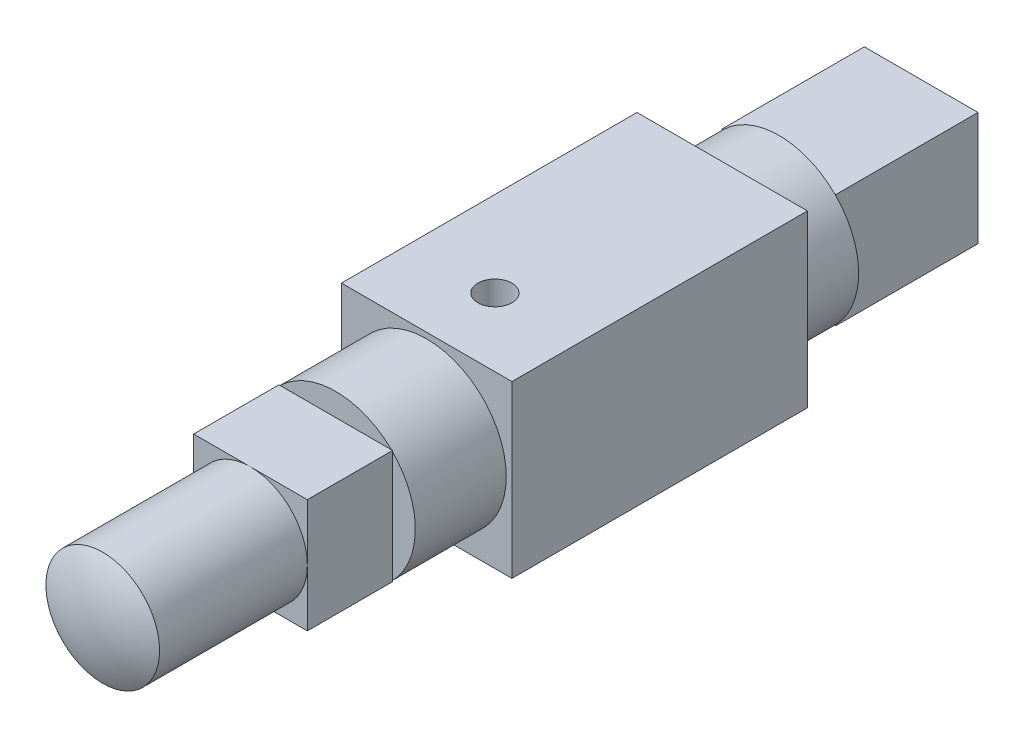
ISO-10303-21;
HEADER;
FILE_DESCRIPTION(('STEP AP214'),'2;1');
FILE_NAME('part.step','',(''),(''),'','','');
FILE_SCHEMA(('AUTOMOTIVE_DESIGN { 1 0 10303 214 1 1 1 1 }'));
ENDSEC;
DATA;
#1=APPLICATION_CONTEXT('core data for automotive mechanical design processes');
#2=APPLICATION_PROTOCOL_DEFINITION('international standard','automotive_design',2000,#1);
#3=PRODUCT_CONTEXT('',#1,'mechanical');
#4=PRODUCT('Part','Part','',(#3));
#5=PRODUCT_RELATED_PRODUCT_CATEGORY('part','',(#4));
#6=PRODUCT_DEFINITION_FORMATION('','',#4);
#7=PRODUCT_DEFINITION_CONTEXT('part definition',#1,'design');
#8=PRODUCT_DEFINITION('design','',#6,#7);
#9=PRODUCT_DEFINITION_SHAPE('','',#8);
#10=(LENGTH_UNIT() NAMED_UNIT(*) SI_UNIT(.MILLI.,.METRE.));
#11=(NAMED_UNIT(*) PLANE_ANGLE_UNIT() SI_UNIT($,.RADIAN.));
#12=(NAMED_UNIT(*) SI_UNIT($,.STERADIAN.) SOLID_ANGLE_UNIT());
#13=UNCERTAINTY_MEASURE_WITH_UNIT(LENGTH_MEASURE(1.E-05),#10,'distance_accuracy_value','');
#14=(GEOMETRIC_REPRESENTATION_CONTEXT(3) GLOBAL_UNCERTAINTY_ASSIGNED_CONTEXT((#13)) GLOBAL_UNIT_ASSIGNED_CONTEXT((#10,
#11,#12)) REPRESENTATION_CONTEXT('',''));
#15=CARTESIAN_POINT('',(0.,0.,0.));
#16=DIRECTION('',(0.,0.,1.));
#17=DIRECTION('',(1.,0.,0.));
#18=AXIS2_PLACEMENT_3D('',#15,#16,#17);
#19=CARTESIAN_POINT('',(0.,0.,-5.));
#20=DIRECTION('',(0.,0.,-1.));
#21=DIRECTION('',(-1.,0.,0.));
#22=AXIS2_PLACEMENT_3D('',#19,#20,#21);
#23=PLANE('',#22);
#24=DIRECTION('',(0.,1.,0.));
#25=VECTOR('',#24,1.);
#26=CARTESIAN_POINT('',(-5.,-5.,-5.));
#27=LINE('',#26,#25);
#28=CARTESIAN_POINT('',(-5.,-4.89897948556636,-5.));
#29=VERTEX_POINT('',#28);
#30=CARTESIAN_POINT('',(-5.,4.89897948556636,-5.));
#31=VERTEX_POINT('',#30);
#32=EDGE_CURVE('E11',#29,#31,#27,.T.);
#33=ORIENTED_EDGE('',*,*,#32,.F.);
#34=CARTESIAN_POINT('',(0.,0.,-5.));
#35=DIRECTION('',(0.,0.,-1.));
#36=DIRECTION('',(-1.,0.,0.));
#37=AXIS2_PLACEMENT_3D('',#34,#35,#36);
#38=CIRCLE('',#37,7.);
#39=EDGE_CURVE('E218',#29,#31,#38,.T.);
#40=ORIENTED_EDGE('',*,*,#39,.T.);
#41=EDGE_LOOP('',(#33,#40));
#42=FACE_BOUND('',#41,.T.);
#43=ADVANCED_FACE('F40',(#42),#23,.T.);
#44=DIRECTION('',(-1.,0.,0.));
#45=VECTOR('',#44,1.);
#46=CARTESIAN_POINT('',(5.,-5.,-5.));
#47=LINE('',#46,#45);
#48=CARTESIAN_POINT('',(4.89897948556636,-5.,-5.));
#49=VERTEX_POINT('',#48);
#50=CARTESIAN_POINT('',(-4.89897948556636,-5.,-5.));
#51=VERTEX_POINT('',#50);
#52=EDGE_CURVE('E49',#49,#51,#47,.T.);
#53=ORIENTED_EDGE('',*,*,#52,.F.);
#54=EDGE_CURVE('E436',#49,#51,#38,.T.);
#55=ORIENTED_EDGE('',*,*,#54,.T.);
#56=EDGE_LOOP('',(#53,#55));
#57=FACE_BOUND('',#56,.T.);
#58=ADVANCED_FACE('F363',(#57),#23,.T.);
#59=DIRECTION('',(0.,-1.,0.));
#60=VECTOR('',#59,1.);
#61=CARTESIAN_POINT('',(5.,-5.,-5.));
#62=LINE('',#61,#60);
#63=CARTESIAN_POINT('',(5.,4.89897948556636,-5.));
#64=VERTEX_POINT('',#63);
#65=CARTESIAN_POINT('',(5.,-4.89897948556636,-5.));
#66=VERTEX_POINT('',#65);
#67=EDGE_CURVE('E398',#64,#66,#62,.T.);
#68=ORIENTED_EDGE('',*,*,#67,.F.);
#69=EDGE_CURVE('E400',#64,#66,#38,.T.);
#70=ORIENTED_EDGE('',*,*,#69,.T.);
#71=EDGE_LOOP('',(#68,#70));
#72=FACE_BOUND('',#71,.T.);
#73=ADVANCED_FACE('F369',(#72),#23,.T.);
#74=CARTESIAN_POINT('',(0.,0.,41.5));
#75=DIRECTION('',(0.,0.,-1.));
#76=DIRECTION('',(-1.,0.,0.));
#77=AXIS2_PLACEMENT_3D('',#74,#75,#76);
#78=PLANE('',#77);
#79=CARTESIAN_POINT('',(0.,0.,41.5));
#80=DIRECTION('',(0.,0.,1.));
#81=DIRECTION('',(1.,0.,0.));
#82=AXIS2_PLACEMENT_3D('',#79,#80,#81);
#83=CIRCLE('',#82,5.);
#84=CARTESIAN_POINT('',(5.,0.,41.5));
#85=VERTEX_POINT('',#84);
#86=CARTESIAN_POINT('',(0.,5.,41.5));
#87=VERTEX_POINT('',#86);
#88=EDGE_CURVE('E227',#85,#87,#83,.T.);
#89=ORIENTED_EDGE('',*,*,#88,.F.);
#90=DIRECTION('',(0.,1.,0.));
#91=VECTOR('',#90,1.);
#92=CARTESIAN_POINT('',(5.,-5.,41.5));
#93=LINE('',#92,#91);
#94=CARTESIAN_POINT('',(5.,5.,41.5));
#95=VERTEX_POINT('',#94);
#96=EDGE_CURVE('E244',#85,#95,#93,.T.);
#97=ORIENTED_EDGE('',*,*,#96,.T.);
#98=DIRECTION('',(-1.,0.,0.));
#99=VECTOR('',#98,1.);
#100=CARTESIAN_POINT('',(-5.,5.,41.5));
#101=LINE('',#100,#99);
#102=EDGE_CURVE('E245',#95,#87,#101,.T.);
#103=ORIENTED_EDGE('',*,*,#102,.T.);
#104=EDGE_LOOP('',(#89,#97,#103));
#105=FACE_BOUND('',#104,.T.);
#106=ADVANCED_FACE('F387',(#105),#78,.F.);
#107=CARTESIAN_POINT('',(-5.,0.,41.5));
#108=VERTEX_POINT('',#107);
#109=EDGE_CURVE('E233',#87,#108,#83,.T.);
#110=ORIENTED_EDGE('',*,*,#109,.F.);
#111=CARTESIAN_POINT('',(-5.,5.,41.5));
#112=VERTEX_POINT('',#111);
#113=EDGE_CURVE('E243',#87,#112,#101,.T.);
#114=ORIENTED_EDGE('',*,*,#113,.T.);
#115=DIRECTION('',(0.,-1.,0.));
#116=VECTOR('',#115,1.);
#117=CARTESIAN_POINT('',(-5.,-5.,41.5));
#118=LINE('',#117,#116);
#119=EDGE_CURVE('E249',#112,#108,#118,.T.);
#120=ORIENTED_EDGE('',*,*,#119,.T.);
#121=EDGE_LOOP('',(#110,#114,#120));
#122=FACE_BOUND('',#121,.T.);
#123=ADVANCED_FACE('F392',(#122),#78,.F.);
#124=CARTESIAN_POINT('',(0.,-5.,41.5));
#125=VERTEX_POINT('',#124);
#126=EDGE_CURVE('E802',#108,#125,#83,.T.);
#127=ORIENTED_EDGE('',*,*,#126,.F.);
#128=CARTESIAN_POINT('',(-5.,-5.,41.5));
#129=VERTEX_POINT('',#128);
#130=EDGE_CURVE('E248',#108,#129,#118,.T.);
#131=ORIENTED_EDGE('',*,*,#130,.T.);
#132=DIRECTION('',(1.,0.,0.));
#133=VECTOR('',#132,1.);
#134=CARTESIAN_POINT('',(-5.,-5.,41.5));
#135=LINE('',#134,#133);
#136=EDGE_CURVE('E253',#129,#125,#135,.T.);
#137=ORIENTED_EDGE('',*,*,#136,.T.);
#138=EDGE_LOOP('',(#127,#131,#137));
#139=FACE_BOUND('',#138,.T.);
#140=ADVANCED_FACE('F582',(#139),#78,.F.);
#141=CARTESIAN_POINT('',(0.,0.,34.));
#142=DIRECTION('',(0.,0.,1.));
#143=DIRECTION('',(1.,0.,0.));
#144=AXIS2_PLACEMENT_3D('',#141,#142,#143);
#145=PLANE('',#144);
#146=DIRECTION('',(0.,1.,0.));
#147=VECTOR('',#146,1.);
#148=CARTESIAN_POINT('',(5.,-5.,34.));
#149=LINE('',#148,#147);
#150=CARTESIAN_POINT('',(5.,-4.89897948556636,34.));
#151=VERTEX_POINT('',#150);
#152=CARTESIAN_POINT('',(5.,4.89897948556636,34.));
#153=VERTEX_POINT('',#152);
#154=EDGE_CURVE('E261',#151,#153,#149,.T.);
#155=ORIENTED_EDGE('',*,*,#154,.F.);
#156=CARTESIAN_POINT('',(0.,0.,34.));
#157=DIRECTION('',(0.,0.,1.));
#158=DIRECTION('',(1.,0.,0.));
#159=AXIS2_PLACEMENT_3D('',#156,#157,#158);
#160=CIRCLE('',#159,7.);
#161=EDGE_CURVE('E287',#151,#153,#160,.T.);
#162=ORIENTED_EDGE('',*,*,#161,.T.);
#163=EDGE_LOOP('',(#155,#162));
#164=FACE_BOUND('',#163,.T.);
#165=ADVANCED_FACE('F591',(#164),#145,.T.);
#166=DIRECTION('',(1.,0.,0.));
#167=VECTOR('',#166,1.);
#168=CARTESIAN_POINT('',(-5.,-5.,34.));
#169=LINE('',#168,#167);
#170=CARTESIAN_POINT('',(-4.89897948556636,-5.,34.));
#171=VERTEX_POINT('',#170);
#172=CARTESIAN_POINT('',(4.89897948556636,-5.,34.));
#173=VERTEX_POINT('',#172);
#174=EDGE_CURVE('E275',#171,#173,#169,.T.);
#175=ORIENTED_EDGE('',*,*,#174,.F.);
#176=EDGE_CURVE('E813',#171,#173,#160,.T.);
#177=ORIENTED_EDGE('',*,*,#176,.T.);
#178=EDGE_LOOP('',(#175,#177));
#179=FACE_BOUND('',#178,.T.);
#180=ADVANCED_FACE('F684',(#179),#145,.T.);
#181=DIRECTION('',(0.,-1.,0.));
#182=VECTOR('',#181,1.);
#183=CARTESIAN_POINT('',(-5.,-5.,34.));
#184=LINE('',#183,#182);
#185=CARTESIAN_POINT('',(-5.,4.89897948556636,34.));
#186=VERTEX_POINT('',#185);
#187=CARTESIAN_POINT('',(-5.,-4.89897948556636,34.));
#188=VERTEX_POINT('',#187);
#189=EDGE_CURVE('E271',#186,#188,#184,.T.);
#190=ORIENTED_EDGE('',*,*,#189,.F.);
#191=EDGE_CURVE('E816',#186,#188,#160,.T.);
#192=ORIENTED_EDGE('',*,*,#191,.T.);
#193=EDGE_LOOP('',(#190,#192));
#194=FACE_BOUND('',#193,.T.);
#195=ADVANCED_FACE('F695',(#194),#145,.T.);
#196=CARTESIAN_POINT('',(7.5,-7.5,26.));
#197=DIRECTION('',(-1.,0.,0.));
#198=DIRECTION('',(0.,0.,1.));
#199=AXIS2_PLACEMENT_3D('',#196,#197,#198);
#200=PLANE('',#199);
#201=DIRECTION('',(0.,1.,0.));
#202=VECTOR('',#201,1.);
#203=CARTESIAN_POINT('',(7.5,-7.5,0.));
#204=LINE('',#203,#202);
#205=CARTESIAN_POINT('',(7.5,-7.5,0.));
#206=VERTEX_POINT('',#205);
#207=CARTESIAN_POINT('',(7.5,7.5,0.));
#208=VERTEX_POINT('',#207);
#209=EDGE_CURVE('E299',#206,#208,#204,.T.);
#210=ORIENTED_EDGE('',*,*,#209,.T.);
#211=DIRECTION('',(0.,0.,-1.));
#212=VECTOR('',#211,1.);
#213=CARTESIAN_POINT('',(7.5,7.5,26.));
#214=LINE('',#213,#212);
#215=CARTESIAN_POINT('',(7.5,7.5,26.));
#216=VERTEX_POINT('',#215);
#217=EDGE_CURVE('E44',#216,#208,#214,.T.);
#218=ORIENTED_EDGE('',*,*,#217,.F.);
#219=DIRECTION('',(0.,1.,0.));
#220=VECTOR('',#219,1.);
#221=CARTESIAN_POINT('',(7.5,-7.5,26.));
#222=LINE('',#221,#220);
#223=CARTESIAN_POINT('',(7.5,-7.5,26.));
#224=VERTEX_POINT('',#223);
#225=EDGE_CURVE('E302',#224,#216,#222,.T.);
#226=ORIENTED_EDGE('',*,*,#225,.F.);
#227=DIRECTION('',(0.,0.,-1.));
#228=VECTOR('',#227,1.);
#229=CARTESIAN_POINT('',(7.5,-7.5,26.));
#230=LINE('',#229,#228);
#231=EDGE_CURVE('E312',#224,#206,#230,.T.);
#232=ORIENTED_EDGE('',*,*,#231,.T.);
#233=EDGE_LOOP('',(#210,#218,#226,#232));
#234=FACE_BOUND('',#233,.T.);
#235=ADVANCED_FACE('F42',(#234),#200,.F.);
#236=CARTESIAN_POINT('',(-7.5,7.5,26.));
#237=DIRECTION('',(0.,-1.,0.));
#238=DIRECTION('',(0.,0.,-1.));
#239=AXIS2_PLACEMENT_3D('',#236,#237,#238);
#240=PLANE('',#239);
#241=CARTESIAN_POINT('',(0.,7.5,20.));
#242=DIRECTION('',(0.,1.,0.));
#243=DIRECTION('',(0.,0.,1.));
#244=AXIS2_PLACEMENT_3D('',#241,#242,#243);
#245=CIRCLE('',#244,1.5);
#246=CARTESIAN_POINT('',(0.,7.5,21.5));
#247=VERTEX_POINT('',#246);
#248=EDGE_CURVE('E291',#247,#247,#245,.T.);
#249=ORIENTED_EDGE('',*,*,#248,.F.);
#250=EDGE_LOOP('',(#249));
#251=FACE_BOUND('',#250,.T.);
#252=DIRECTION('',(-1.,0.,0.));
#253=VECTOR('',#252,1.);
#254=CARTESIAN_POINT('',(-7.5,7.5,0.));
#255=LINE('',#254,#253);
#256=CARTESIAN_POINT('',(-7.5,7.5,0.));
#257=VERTEX_POINT('',#256);
#258=EDGE_CURVE('E315',#208,#257,#255,.T.);
#259=ORIENTED_EDGE('',*,*,#258,.T.);
#260=DIRECTION('',(0.,0.,-1.));
#261=VECTOR('',#260,1.);
#262=CARTESIAN_POINT('',(-7.5,7.5,26.));
#263=LINE('',#262,#261);
#264=CARTESIAN_POINT('',(-7.5,7.5,26.));
#265=VERTEX_POINT('',#264);
#266=EDGE_CURVE('E324',#265,#257,#263,.T.);
#267=ORIENTED_EDGE('',*,*,#266,.F.);
#268=DIRECTION('',(-1.,0.,0.));
#269=VECTOR('',#268,1.);
#270=CARTESIAN_POINT('',(-7.5,7.5,26.));
#271=LINE('',#270,#269);
#272=EDGE_CURVE('E305',#216,#265,#271,.T.);
#273=ORIENTED_EDGE('',*,*,#272,.F.);
#274=ORIENTED_EDGE('',*,*,#217,.T.);
#275=EDGE_LOOP('',(#259,#267,#273,#274));
#276=FACE_BOUND('',#275,.T.);
#277=ADVANCED_FACE('F333',(#251,#276),#240,.F.);
#278=CARTESIAN_POINT('',(-7.5,-7.5,26.));
#279=DIRECTION('',(1.,0.,0.));
#280=DIRECTION('',(0.,0.,-1.));
#281=AXIS2_PLACEMENT_3D('',#278,#279,#280);
#282=PLANE('',#281);
#283=DIRECTION('',(0.,-1.,0.));
#284=VECTOR('',#283,1.);
#285=CARTESIAN_POINT('',(-7.5,-7.5,0.));
#286=LINE('',#285,#284);
#287=CARTESIAN_POINT('',(-7.5,-7.5,0.));
#288=VERTEX_POINT('',#287);
#289=EDGE_CURVE('E317',#257,#288,#286,.T.);
#290=ORIENTED_EDGE('',*,*,#289,.T.);
#291=DIRECTION('',(0.,0.,-1.));
#292=VECTOR('',#291,1.);
#293=CARTESIAN_POINT('',(-7.5,-7.5,26.));
#294=LINE('',#293,#292);
#295=CARTESIAN_POINT('',(-7.5,-7.5,26.));
#296=VERTEX_POINT('',#295);
#297=EDGE_CURVE('E322',#296,#288,#294,.T.);
#298=ORIENTED_EDGE('',*,*,#297,.F.);
#299=DIRECTION('',(0.,-1.,0.));
#300=VECTOR('',#299,1.);
#301=CARTESIAN_POINT('',(-7.5,-7.5,26.));
#302=LINE('',#301,#300);
#303=EDGE_CURVE('E308',#265,#296,#302,.T.);
#304=ORIENTED_EDGE('',*,*,#303,.F.);
#305=ORIENTED_EDGE('',*,*,#266,.T.);
#306=EDGE_LOOP('',(#290,#298,#304,#305));
#307=FACE_BOUND('',#306,.T.);
#308=ADVANCED_FACE('F342',(#307),#282,.F.);
#309=CARTESIAN_POINT('',(-7.5,-7.5,26.));
#310=DIRECTION('',(0.,1.,0.));
#311=DIRECTION('',(0.,0.,1.));
#312=AXIS2_PLACEMENT_3D('',#309,#310,#311);
#313=PLANE('',#312);
#314=CARTESIAN_POINT('',(0.,-7.5,20.));
#315=DIRECTION('',(0.,1.,0.));
#316=DIRECTION('',(0.,0.,1.));
#317=AXIS2_PLACEMENT_3D('',#314,#315,#316);
#318=CIRCLE('',#317,1.5);
#319=CARTESIAN_POINT('',(0.,-7.5,21.5));
#320=VERTEX_POINT('',#319);
#321=EDGE_CURVE('E296',#320,#320,#318,.T.);
#322=ORIENTED_EDGE('',*,*,#321,.T.);
#323=EDGE_LOOP('',(#322));
#324=FACE_BOUND('',#323,.T.);
#325=DIRECTION('',(1.,0.,0.));
#326=VECTOR('',#325,1.);
#327=CARTESIAN_POINT('',(-7.5,-7.5,0.));
#328=LINE('',#327,#326);
#329=EDGE_CURVE('E306',#288,#206,#328,.T.);
#330=ORIENTED_EDGE('',*,*,#329,.T.);
#331=ORIENTED_EDGE('',*,*,#231,.F.);
#332=DIRECTION('',(1.,0.,0.));
#333=VECTOR('',#332,1.);
#334=CARTESIAN_POINT('',(-7.5,-7.5,26.));
#335=LINE('',#334,#333);
#336=EDGE_CURVE('E310',#296,#224,#335,.T.);
#337=ORIENTED_EDGE('',*,*,#336,.F.);
#338=ORIENTED_EDGE('',*,*,#297,.T.);
#339=EDGE_LOOP('',(#330,#331,#337,#338));
#340=FACE_BOUND('',#339,.T.);
#341=ADVANCED_FACE('F345',(#324,#340),#313,.F.);
#342=CARTESIAN_POINT('',(0.,0.,26.));
#343=DIRECTION('',(0.,0.,-1.));
#344=DIRECTION('',(-1.,0.,0.));
#345=AXIS2_PLACEMENT_3D('',#342,#343,#344);
#346=PLANE('',#345);
#347=CARTESIAN_POINT('',(0.,0.,26.));
#348=DIRECTION('',(0.,0.,1.));
#349=DIRECTION('',(1.,0.,0.));
#350=AXIS2_PLACEMENT_3D('',#347,#348,#349);
#351=CIRCLE('',#350,7.);
#352=CARTESIAN_POINT('',(7.,0.,26.));
#353=VERTEX_POINT('',#352);
#354=EDGE_CURVE('E293',#353,#353,#351,.T.);
#355=ORIENTED_EDGE('',*,*,#354,.F.);
#356=EDGE_LOOP('',(#355));
#357=FACE_BOUND('',#356,.T.);
#358=ORIENTED_EDGE('',*,*,#225,.T.);
#359=ORIENTED_EDGE('',*,*,#272,.T.);
#360=ORIENTED_EDGE('',*,*,#303,.T.);
#361=ORIENTED_EDGE('',*,*,#336,.T.);
#362=EDGE_LOOP('',(#358,#359,#360,#361));
#363=FACE_BOUND('',#362,.T.);
#364=ADVANCED_FACE('F347',(#357,#363),#346,.F.);
#365=CARTESIAN_POINT('',(0.,0.,0.));
#366=DIRECTION('',(0.,0.,-1.));
#367=DIRECTION('',(-1.,0.,0.));
#368=AXIS2_PLACEMENT_3D('',#365,#366,#367);
#369=PLANE('',#368);
#370=CARTESIAN_POINT('',(0.,0.,0.));
#371=DIRECTION('',(0.,0.,-1.));
#372=DIRECTION('',(-1.,0.,0.));
#373=AXIS2_PLACEMENT_3D('',#370,#371,#372);
#374=CIRCLE('',#373,7.);
#375=CARTESIAN_POINT('',(-7.,0.,0.));
#376=VERTEX_POINT('',#375);
#377=EDGE_CURVE('E229',#376,#376,#374,.T.);
#378=ORIENTED_EDGE('',*,*,#377,.F.);
#379=EDGE_LOOP('',(#378));
#380=FACE_BOUND('',#379,.T.);
#381=ORIENTED_EDGE('',*,*,#209,.F.);
#382=ORIENTED_EDGE('',*,*,#329,.F.);
#383=ORIENTED_EDGE('',*,*,#289,.F.);
#384=ORIENTED_EDGE('',*,*,#258,.F.);
#385=EDGE_LOOP('',(#381,#382,#383,#384));
#386=FACE_BOUND('',#385,.T.);
#387=ADVANCED_FACE('F340',(#380,#386),#369,.T.);
#388=CARTESIAN_POINT('',(0.,-7.5,20.));
#389=DIRECTION('',(0.,1.,0.));
#390=DIRECTION('',(0.,0.,1.));
#391=AXIS2_PLACEMENT_3D('',#388,#389,#390);
#392=CYLINDRICAL_SURFACE('',#391,1.5);
#393=ORIENTED_EDGE('',*,*,#321,.F.);
#394=EDGE_LOOP('',(#393));
#395=FACE_BOUND('',#394,.T.);
#396=ORIENTED_EDGE('',*,*,#248,.T.);
#397=EDGE_LOOP('',(#396));
#398=FACE_BOUND('',#397,.T.);
#399=ADVANCED_FACE('F355',(#395,#398),#392,.F.);
#400=CARTESIAN_POINT('',(0.,0.,34.));
#401=DIRECTION('',(0.,0.,-1.));
#402=DIRECTION('',(-1.,0.,0.));
#403=AXIS2_PLACEMENT_3D('',#400,#401,#402);
#404=CYLINDRICAL_SURFACE('',#403,7.);
#405=CARTESIAN_POINT('',(4.89897948556636,5.,34.));
#406=VERTEX_POINT('',#405);
#407=EDGE_CURVE('E288',#153,#406,#160,.T.);
#408=ORIENTED_EDGE('',*,*,#407,.F.);
#409=ORIENTED_EDGE('',*,*,#161,.F.);
#410=EDGE_CURVE('E810',#173,#151,#160,.T.);
#411=ORIENTED_EDGE('',*,*,#410,.F.);
#412=ORIENTED_EDGE('',*,*,#176,.F.);
#413=EDGE_CURVE('E814',#188,#171,#160,.T.);
#414=ORIENTED_EDGE('',*,*,#413,.F.);
#415=ORIENTED_EDGE('',*,*,#191,.F.);
#416=CARTESIAN_POINT('',(-4.89897948556636,5.,34.));
#417=VERTEX_POINT('',#416);
#418=EDGE_CURVE('E820',#417,#186,#160,.T.);
#419=ORIENTED_EDGE('',*,*,#418,.F.);
#420=EDGE_CURVE('E292',#406,#417,#160,.T.);
#421=ORIENTED_EDGE('',*,*,#420,.F.);
#422=EDGE_LOOP('',(#408,#409,#411,#412,#414,#415,#419,#421));
#423=FACE_BOUND('',#422,.T.);
#424=ORIENTED_EDGE('',*,*,#354,.T.);
#425=EDGE_LOOP('',(#424));
#426=FACE_BOUND('',#425,.T.);
#427=ADVANCED_FACE('F712',(#423,#426),#404,.T.);
#428=DIRECTION('',(-1.,0.,0.));
#429=VECTOR('',#428,1.);
#430=CARTESIAN_POINT('',(-5.,5.,34.));
#431=LINE('',#430,#429);
#432=EDGE_CURVE('E266',#406,#417,#431,.T.);
#433=ORIENTED_EDGE('',*,*,#432,.F.);
#434=ORIENTED_EDGE('',*,*,#420,.T.);
#435=EDGE_LOOP('',(#433,#434));
#436=FACE_BOUND('',#435,.T.);
#437=ADVANCED_FACE('F674',(#436),#145,.T.);
#438=CARTESIAN_POINT('',(0.,0.,34.));
#439=DIRECTION('',(0.,0.,-1.));
#440=DIRECTION('',(-1.,0.,0.));
#441=AXIS2_PLACEMENT_3D('',#438,#439,#440);
#442=PLANE('',#441);
#443=CARTESIAN_POINT('',(5.,5.,34.));
#444=VERTEX_POINT('',#443);
#445=EDGE_CURVE('E237',#153,#444,#149,.T.);
#446=ORIENTED_EDGE('',*,*,#445,.F.);
#447=ORIENTED_EDGE('',*,*,#407,.T.);
#448=EDGE_CURVE('E262',#444,#406,#431,.T.);
#449=ORIENTED_EDGE('',*,*,#448,.F.);
#450=EDGE_LOOP('',(#446,#447,#449));
#451=FACE_BOUND('',#450,.T.);
#452=ADVANCED_FACE('F602',(#451),#442,.T.);
#453=CARTESIAN_POINT('',(-5.,5.,34.));
#454=VERTEX_POINT('',#453);
#455=EDGE_CURVE('E260',#417,#454,#431,.T.);
#456=ORIENTED_EDGE('',*,*,#455,.F.);
#457=ORIENTED_EDGE('',*,*,#418,.T.);
#458=EDGE_CURVE('E267',#454,#186,#184,.T.);
#459=ORIENTED_EDGE('',*,*,#458,.F.);
#460=EDGE_LOOP('',(#456,#457,#459));
#461=FACE_BOUND('',#460,.T.);
#462=ADVANCED_FACE('F657',(#461),#442,.T.);
#463=CARTESIAN_POINT('',(-5.,-5.,34.));
#464=VERTEX_POINT('',#463);
#465=EDGE_CURVE('E265',#188,#464,#184,.T.);
#466=ORIENTED_EDGE('',*,*,#465,.F.);
#467=ORIENTED_EDGE('',*,*,#413,.T.);
#468=EDGE_CURVE('E272',#464,#171,#169,.T.);
#469=ORIENTED_EDGE('',*,*,#468,.F.);
#470=EDGE_LOOP('',(#466,#467,#469));
#471=FACE_BOUND('',#470,.T.);
#472=ADVANCED_FACE('F603',(#471),#442,.T.);
#473=CARTESIAN_POINT('',(5.,-5.,41.5));
#474=DIRECTION('',(-1.,0.,0.));
#475=DIRECTION('',(0.,0.,1.));
#476=AXIS2_PLACEMENT_3D('',#473,#474,#475);
#477=PLANE('',#476);
#478=CARTESIAN_POINT('',(5.,-5.,34.));
#479=VERTEX_POINT('',#478);
#480=EDGE_CURVE('E257',#479,#151,#149,.T.);
#481=ORIENTED_EDGE('',*,*,#480,.T.);
#482=ORIENTED_EDGE('',*,*,#154,.T.);
#483=ORIENTED_EDGE('',*,*,#445,.T.);
#484=DIRECTION('',(0.,0.,-1.));
#485=VECTOR('',#484,1.);
#486=CARTESIAN_POINT('',(5.,5.,41.5));
#487=LINE('',#486,#485);
#488=EDGE_CURVE('E284',#95,#444,#487,.T.);
#489=ORIENTED_EDGE('',*,*,#488,.F.);
#490=ORIENTED_EDGE('',*,*,#96,.F.);
#491=CARTESIAN_POINT('',(5.,-5.,41.5));
#492=VERTEX_POINT('',#491);
#493=EDGE_CURVE('E241',#492,#85,#93,.T.);
#494=ORIENTED_EDGE('',*,*,#493,.F.);
#495=DIRECTION('',(0.,0.,-1.));
#496=VECTOR('',#495,1.);
#497=CARTESIAN_POINT('',(5.,-5.,41.5));
#498=LINE('',#497,#496);
#499=EDGE_CURVE('E256',#492,#479,#498,.T.);
#500=ORIENTED_EDGE('',*,*,#499,.T.);
#501=EDGE_LOOP('',(#481,#482,#483,#489,#490,#494,#500));
#502=FACE_BOUND('',#501,.T.);
#503=ADVANCED_FACE('F640',(#502),#477,.F.);
#504=CARTESIAN_POINT('',(-5.,5.,41.5));
#505=DIRECTION('',(0.,-1.,0.));
#506=DIRECTION('',(0.,0.,-1.));
#507=AXIS2_PLACEMENT_3D('',#504,#505,#506);
#508=PLANE('',#507);
#509=ORIENTED_EDGE('',*,*,#448,.T.);
#510=ORIENTED_EDGE('',*,*,#432,.T.);
#511=ORIENTED_EDGE('',*,*,#455,.T.);
#512=DIRECTION('',(0.,0.,-1.));
#513=VECTOR('',#512,1.);
#514=CARTESIAN_POINT('',(-5.,5.,41.5));
#515=LINE('',#514,#513);
#516=EDGE_CURVE('E281',#112,#454,#515,.T.);
#517=ORIENTED_EDGE('',*,*,#516,.F.);
#518=ORIENTED_EDGE('',*,*,#113,.F.);
#519=ORIENTED_EDGE('',*,*,#102,.F.);
#520=ORIENTED_EDGE('',*,*,#488,.T.);
#521=EDGE_LOOP('',(#509,#510,#511,#517,#518,#519,#520));
#522=FACE_BOUND('',#521,.T.);
#523=ADVANCED_FACE('F630',(#522),#508,.F.);
#524=CARTESIAN_POINT('',(-5.,-5.,41.5));
#525=DIRECTION('',(1.,0.,0.));
#526=DIRECTION('',(0.,0.,-1.));
#527=AXIS2_PLACEMENT_3D('',#524,#525,#526);
#528=PLANE('',#527);
#529=ORIENTED_EDGE('',*,*,#458,.T.);
#530=ORIENTED_EDGE('',*,*,#189,.T.);
#531=ORIENTED_EDGE('',*,*,#465,.T.);
#532=DIRECTION('',(0.,0.,-1.));
#533=VECTOR('',#532,1.);
#534=CARTESIAN_POINT('',(-5.,-5.,41.5));
#535=LINE('',#534,#533);
#536=EDGE_CURVE('E278',#129,#464,#535,.T.);
#537=ORIENTED_EDGE('',*,*,#536,.F.);
#538=ORIENTED_EDGE('',*,*,#130,.F.);
#539=ORIENTED_EDGE('',*,*,#119,.F.);
#540=ORIENTED_EDGE('',*,*,#516,.T.);
#541=EDGE_LOOP('',(#529,#530,#531,#537,#538,#539,#540));
#542=FACE_BOUND('',#541,.T.);
#543=ADVANCED_FACE('F620',(#542),#528,.F.);
#544=CARTESIAN_POINT('',(-5.,-5.,41.5));
#545=DIRECTION('',(0.,1.,0.));
#546=DIRECTION('',(-1.,0.,0.));
#547=AXIS2_PLACEMENT_3D('',#544,#545,#546);
#548=PLANE('',#547);
#549=ORIENTED_EDGE('',*,*,#468,.T.);
#550=ORIENTED_EDGE('',*,*,#174,.T.);
#551=EDGE_CURVE('E270',#173,#479,#169,.T.);
#552=ORIENTED_EDGE('',*,*,#551,.T.);
#553=ORIENTED_EDGE('',*,*,#499,.F.);
#554=EDGE_CURVE('E252',#125,#492,#135,.T.);
#555=ORIENTED_EDGE('',*,*,#554,.F.);
#556=ORIENTED_EDGE('',*,*,#136,.F.);
#557=ORIENTED_EDGE('',*,*,#536,.T.);
#558=EDGE_LOOP('',(#549,#550,#552,#553,#555,#556,#557));
#559=FACE_BOUND('',#558,.T.);
#560=ADVANCED_FACE('F611',(#559),#548,.F.);
#561=EDGE_CURVE('E240',#125,#85,#83,.T.);
#562=ORIENTED_EDGE('',*,*,#561,.F.);
#563=ORIENTED_EDGE('',*,*,#554,.T.);
#564=ORIENTED_EDGE('',*,*,#493,.T.);
#565=EDGE_LOOP('',(#562,#563,#564));
#566=FACE_BOUND('',#565,.T.);
#567=ADVANCED_FACE('F395',(#566),#78,.F.);
#568=ORIENTED_EDGE('',*,*,#551,.F.);
#569=ORIENTED_EDGE('',*,*,#410,.T.);
#570=ORIENTED_EDGE('',*,*,#480,.F.);
#571=EDGE_LOOP('',(#568,#569,#570));
#572=FACE_BOUND('',#571,.T.);
#573=ADVANCED_FACE('F564',(#572),#442,.T.);
#574=CARTESIAN_POINT('',(0.,0.,54.5));
#575=DIRECTION('',(0.,0.,-1.));
#576=DIRECTION('',(-1.,0.,0.));
#577=AXIS2_PLACEMENT_3D('',#574,#575,#576);
#578=CYLINDRICAL_SURFACE('',#577,5.);
#579=CARTESIAN_POINT('',(0.,0.,54.5));
#580=DIRECTION('',(0.,0.,1.));
#581=DIRECTION('',(1.,0.,0.));
#582=AXIS2_PLACEMENT_3D('',#579,#580,#581);
#583=CIRCLE('',#582,5.);
#584=CARTESIAN_POINT('',(5.,0.,54.5));
#585=VERTEX_POINT('',#584);
#586=EDGE_CURVE('E234',#585,#585,#583,.T.);
#587=ORIENTED_EDGE('',*,*,#586,.F.);
#588=EDGE_LOOP('',(#587));
#589=FACE_BOUND('',#588,.T.);
#590=ORIENTED_EDGE('',*,*,#88,.T.);
#591=ORIENTED_EDGE('',*,*,#109,.T.);
#592=ORIENTED_EDGE('',*,*,#126,.T.);
#593=ORIENTED_EDGE('',*,*,#561,.T.);
#594=EDGE_LOOP('',(#590,#591,#592,#593));
#595=FACE_BOUND('',#594,.T.);
#596=ADVANCED_FACE('F554',(#589,#595),#578,.T.);
#597=CARTESIAN_POINT('',(0.,0.,45.5));
#598=DIRECTION('',(0.,0.,-1.));
#599=DIRECTION('',(1.,0.,0.));
#600=AXIS2_PLACEMENT_3D('',#597,#598,#599);
#601=SPHERICAL_SURFACE('',#600,10.295630140987);
#602=ORIENTED_EDGE('',*,*,#586,.T.);
#603=EDGE_LOOP('',(#602));
#604=FACE_BOUND('',#603,.T.);
#605=ADVANCED_FACE('F385',(#604),#601,.T.);
#606=CARTESIAN_POINT('',(0.,0.,-5.));
#607=DIRECTION('',(0.,0.,1.));
#608=DIRECTION('',(1.,0.,0.));
#609=AXIS2_PLACEMENT_3D('',#606,#607,#608);
#610=CYLINDRICAL_SURFACE('',#609,7.);
#611=CARTESIAN_POINT('',(-4.89897948556636,5.,-5.));
#612=VERTEX_POINT('',#611);
#613=EDGE_CURVE('E221',#31,#612,#38,.T.);
#614=ORIENTED_EDGE('',*,*,#613,.F.);
#615=ORIENTED_EDGE('',*,*,#39,.F.);
#616=EDGE_CURVE('E63',#51,#29,#38,.T.);
#617=ORIENTED_EDGE('',*,*,#616,.F.);
#618=ORIENTED_EDGE('',*,*,#54,.F.);
#619=EDGE_CURVE('E415',#66,#49,#38,.T.);
#620=ORIENTED_EDGE('',*,*,#619,.F.);
#621=ORIENTED_EDGE('',*,*,#69,.F.);
#622=CARTESIAN_POINT('',(4.89897948556636,5.,-5.));
#623=VERTEX_POINT('',#622);
#624=EDGE_CURVE('E412',#623,#64,#38,.T.);
#625=ORIENTED_EDGE('',*,*,#624,.F.);
#626=EDGE_CURVE('E228',#612,#623,#38,.T.);
#627=ORIENTED_EDGE('',*,*,#626,.F.);
#628=EDGE_LOOP('',(#614,#615,#617,#618,#620,#621,#625,#627));
#629=FACE_BOUND('',#628,.T.);
#630=ORIENTED_EDGE('',*,*,#377,.T.);
#631=EDGE_LOOP('',(#630));
#632=FACE_BOUND('',#631,.T.);
#633=ADVANCED_FACE('F375',(#629,#632),#610,.T.);
#634=DIRECTION('',(1.,0.,0.));
#635=VECTOR('',#634,1.);
#636=CARTESIAN_POINT('',(5.,5.,-5.));
#637=LINE('',#636,#635);
#638=EDGE_CURVE('E232',#612,#623,#637,.T.);
#639=ORIENTED_EDGE('',*,*,#638,.F.);
#640=ORIENTED_EDGE('',*,*,#626,.T.);
#641=EDGE_LOOP('',(#639,#640));
#642=FACE_BOUND('',#641,.T.);
#643=ADVANCED_FACE('F365',(#642),#23,.T.);
#644=CARTESIAN_POINT('',(0.,0.,-5.));
#645=DIRECTION('',(0.,0.,1.));
#646=DIRECTION('',(1.,0.,0.));
#647=AXIS2_PLACEMENT_3D('',#644,#645,#646);
#648=PLANE('',#647);
#649=CARTESIAN_POINT('',(-5.,5.,-5.));
#650=VERTEX_POINT('',#649);
#651=EDGE_CURVE('E52',#31,#650,#27,.T.);
#652=ORIENTED_EDGE('',*,*,#651,.F.);
#653=ORIENTED_EDGE('',*,*,#613,.T.);
#654=EDGE_CURVE('E423',#650,#612,#637,.T.);
#655=ORIENTED_EDGE('',*,*,#654,.F.);
#656=EDGE_LOOP('',(#652,#653,#655));
#657=FACE_BOUND('',#656,.T.);
#658=ADVANCED_FACE('F374',(#657),#648,.T.);
#659=CARTESIAN_POINT('',(5.,5.,-5.));
#660=VERTEX_POINT('',#659);
#661=EDGE_CURVE('E418',#623,#660,#637,.T.);
#662=ORIENTED_EDGE('',*,*,#661,.F.);
#663=ORIENTED_EDGE('',*,*,#624,.T.);
#664=EDGE_CURVE('E405',#660,#64,#62,.T.);
#665=ORIENTED_EDGE('',*,*,#664,.F.);
#666=EDGE_LOOP('',(#662,#663,#665));
#667=FACE_BOUND('',#666,.T.);
#668=ADVANCED_FACE('F381',(#667),#648,.T.);
#669=CARTESIAN_POINT('',(5.,-5.,-5.));
#670=VERTEX_POINT('',#669);
#671=EDGE_CURVE('E406',#66,#670,#62,.T.);
#672=ORIENTED_EDGE('',*,*,#671,.F.);
#673=ORIENTED_EDGE('',*,*,#619,.T.);
#674=EDGE_CURVE('E212',#670,#49,#47,.T.);
#675=ORIENTED_EDGE('',*,*,#674,.F.);
#676=EDGE_LOOP('',(#672,#673,#675));
#677=FACE_BOUND('',#676,.T.);
#678=ADVANCED_FACE('F435',(#677),#648,.T.);
#679=CARTESIAN_POINT('',(-5.,-5.,-17.5));
#680=DIRECTION('',(1.,0.,0.));
#681=DIRECTION('',(0.,0.,-1.));
#682=AXIS2_PLACEMENT_3D('',#679,#680,#681);
#683=PLANE('',#682);
#684=CARTESIAN_POINT('',(-5.,-5.,-5.));
#685=VERTEX_POINT('',#684);
#686=EDGE_CURVE('E51',#685,#29,#27,.T.);
#687=ORIENTED_EDGE('',*,*,#686,.T.);
#688=ORIENTED_EDGE('',*,*,#32,.T.);
#689=ORIENTED_EDGE('',*,*,#651,.T.);
#690=DIRECTION('',(0.,0.,1.));
#691=VECTOR('',#690,1.);
#692=CARTESIAN_POINT('',(-5.,5.,-17.5));
#693=LINE('',#692,#691);
#694=CARTESIAN_POINT('',(-5.,5.,-17.5));
#695=VERTEX_POINT('',#694);
#696=EDGE_CURVE('E197',#695,#650,#693,.T.);
#697=ORIENTED_EDGE('',*,*,#696,.F.);
#698=DIRECTION('',(0.,1.,0.));
#699=VECTOR('',#698,1.);
#700=CARTESIAN_POINT('',(-5.,-5.,-17.5));
#701=LINE('',#700,#699);
#702=CARTESIAN_POINT('',(-5.,-5.,-17.5));
#703=VERTEX_POINT('',#702);
#704=EDGE_CURVE('E203',#703,#695,#701,.T.);
#705=ORIENTED_EDGE('',*,*,#704,.F.);
#706=DIRECTION('',(0.,0.,1.));
#707=VECTOR('',#706,1.);
#708=CARTESIAN_POINT('',(-5.,-5.,-17.5));
#709=LINE('',#708,#707);
#710=EDGE_CURVE('E427',#703,#685,#709,.T.);
#711=ORIENTED_EDGE('',*,*,#710,.T.);
#712=EDGE_LOOP('',(#687,#688,#689,#697,#705,#711));
#713=FACE_BOUND('',#712,.T.);
#714=ADVANCED_FACE('F215',(#713),#683,.F.);
#715=CARTESIAN_POINT('',(5.,5.,-17.5));
#716=DIRECTION('',(0.,-1.,0.));
#717=DIRECTION('',(0.,0.,-1.));
#718=AXIS2_PLACEMENT_3D('',#715,#716,#717);
#719=PLANE('',#718);
#720=ORIENTED_EDGE('',*,*,#654,.T.);
#721=ORIENTED_EDGE('',*,*,#638,.T.);
#722=ORIENTED_EDGE('',*,*,#661,.T.);
#723=DIRECTION('',(0.,0.,1.));
#724=VECTOR('',#723,1.);
#725=CARTESIAN_POINT('',(5.,5.,-17.5));
#726=LINE('',#725,#724);
#727=CARTESIAN_POINT('',(5.,5.,-17.5));
#728=VERTEX_POINT('',#727);
#729=EDGE_CURVE('E199',#728,#660,#726,.T.);
#730=ORIENTED_EDGE('',*,*,#729,.F.);
#731=DIRECTION('',(1.,0.,0.));
#732=VECTOR('',#731,1.);
#733=CARTESIAN_POINT('',(5.,5.,-17.5));
#734=LINE('',#733,#732);
#735=EDGE_CURVE('E192',#695,#728,#734,.T.);
#736=ORIENTED_EDGE('',*,*,#735,.F.);
#737=ORIENTED_EDGE('',*,*,#696,.T.);
#738=EDGE_LOOP('',(#720,#721,#722,#730,#736,#737));
#739=FACE_BOUND('',#738,.T.);
#740=ADVANCED_FACE('F195',(#739),#719,.F.);
#741=CARTESIAN_POINT('',(5.,-5.,-17.5));
#742=DIRECTION('',(-1.,0.,0.));
#743=DIRECTION('',(0.,0.,1.));
#744=AXIS2_PLACEMENT_3D('',#741,#742,#743);
#745=PLANE('',#744);
#746=ORIENTED_EDGE('',*,*,#664,.T.);
#747=ORIENTED_EDGE('',*,*,#67,.T.);
#748=ORIENTED_EDGE('',*,*,#671,.T.);
#749=DIRECTION('',(0.,0.,1.));
#750=VECTOR('',#749,1.);
#751=CARTESIAN_POINT('',(5.,-5.,-17.5));
#752=LINE('',#751,#750);
#753=CARTESIAN_POINT('',(5.,-5.,-17.5));
#754=VERTEX_POINT('',#753);
#755=EDGE_CURVE('E222',#754,#670,#752,.T.);
#756=ORIENTED_EDGE('',*,*,#755,.F.);
#757=DIRECTION('',(0.,-1.,0.));
#758=VECTOR('',#757,1.);
#759=CARTESIAN_POINT('',(5.,-5.,-17.5));
#760=LINE('',#759,#758);
#761=EDGE_CURVE('E202',#728,#754,#760,.T.);
#762=ORIENTED_EDGE('',*,*,#761,.F.);
#763=ORIENTED_EDGE('',*,*,#729,.T.);
#764=EDGE_LOOP('',(#746,#747,#748,#756,#762,#763));
#765=FACE_BOUND('',#764,.T.);
#766=ADVANCED_FACE('F420',(#765),#745,.F.);
#767=CARTESIAN_POINT('',(5.,-5.,-17.5));
#768=DIRECTION('',(0.,1.,0.));
#769=DIRECTION('',(0.,0.,1.));
#770=AXIS2_PLACEMENT_3D('',#767,#768,#769);
#771=PLANE('',#770);
#772=ORIENTED_EDGE('',*,*,#674,.T.);
#773=ORIENTED_EDGE('',*,*,#52,.T.);
#774=EDGE_CURVE('E421',#51,#685,#47,.T.);
#775=ORIENTED_EDGE('',*,*,#774,.T.);
#776=ORIENTED_EDGE('',*,*,#710,.F.);
#777=DIRECTION('',(-1.,0.,0.));
#778=VECTOR('',#777,1.);
#779=CARTESIAN_POINT('',(5.,-5.,-17.5));
#780=LINE('',#779,#778);
#781=EDGE_CURVE('E208',#754,#703,#780,.T.);
#782=ORIENTED_EDGE('',*,*,#781,.F.);
#783=ORIENTED_EDGE('',*,*,#755,.T.);
#784=EDGE_LOOP('',(#772,#773,#775,#776,#782,#783));
#785=FACE_BOUND('',#784,.T.);
#786=ADVANCED_FACE('F432',(#785),#771,.F.);
#787=CARTESIAN_POINT('',(0.,0.,-17.5));
#788=DIRECTION('',(0.,0.,1.));
#789=DIRECTION('',(1.,0.,0.));
#790=AXIS2_PLACEMENT_3D('',#787,#788,#789);
#791=PLANE('',#790);
#792=ORIENTED_EDGE('',*,*,#704,.T.);
#793=ORIENTED_EDGE('',*,*,#735,.T.);
#794=ORIENTED_EDGE('',*,*,#761,.T.);
#795=ORIENTED_EDGE('',*,*,#781,.T.);
#796=EDGE_LOOP('',(#792,#793,#794,#795));
#797=FACE_BOUND('',#796,.T.);
#798=ADVANCED_FACE('F206',(#797),#791,.F.);
#799=ORIENTED_EDGE('',*,*,#774,.F.);
#800=ORIENTED_EDGE('',*,*,#616,.T.);
#801=ORIENTED_EDGE('',*,*,#686,.F.);
#802=EDGE_LOOP('',(#799,#800,#801));
#803=FACE_BOUND('',#802,.T.);
#804=ADVANCED_FACE('F384',(#803),#648,.T.);
#805=CLOSED_SHELL('',(#43,#58,#73,#106,#123,#140,#165,#180,#195,#235,#277,#308,#341,#364,#387,
#399,#427,#437,#452,#462,#472,#503,#523,#543,#560,#567,#573,#596,#605,#633,#643,#658,#668,#678,
#714,#740,#766,#786,#798,#804));
#806=MANIFOLD_SOLID_BREP('B2',#805);
#807=ADVANCED_BREP_SHAPE_REPRESENTATION('',(#18,#806),#14);
#808=SHAPE_DEFINITION_REPRESENTATION(#9,#807);
ENDSEC;
END-ISO-10303-21;
